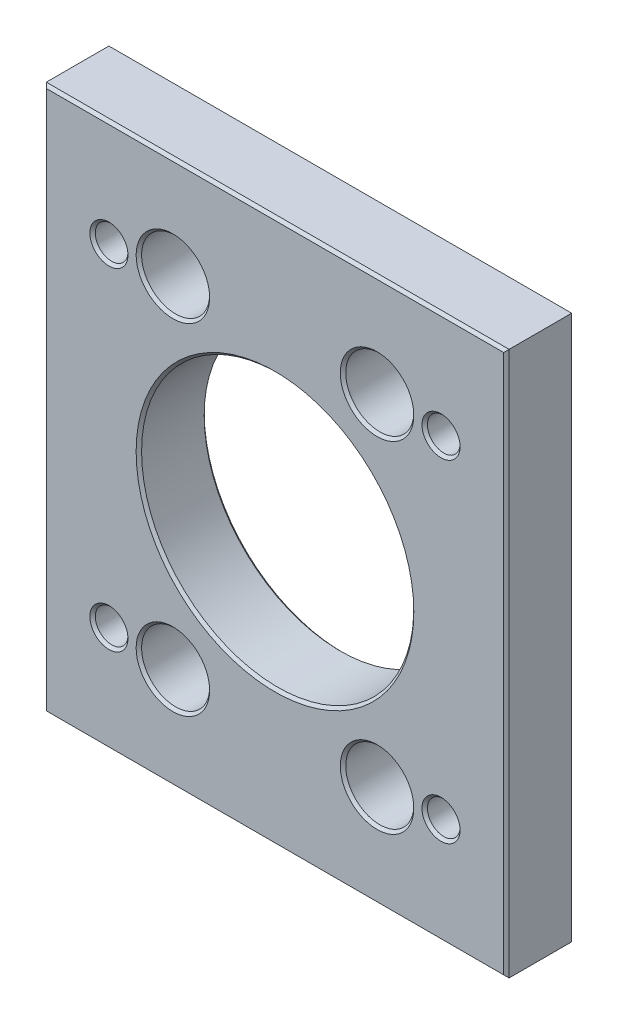
ISO-10303-21;
HEADER;
FILE_DESCRIPTION(('STEP AP214'),'2;1');
FILE_NAME('part.step','',(''),(''),'','','');
FILE_SCHEMA(('AUTOMOTIVE_DESIGN { 1 0 10303 214 1 1 1 1 }'));
ENDSEC;
DATA;
#1=APPLICATION_CONTEXT('core data for automotive mechanical design processes');
#2=APPLICATION_PROTOCOL_DEFINITION('international standard','automotive_design',2000,#1);
#3=PRODUCT_CONTEXT('',#1,'mechanical');
#4=PRODUCT('Part','Part','',(#3));
#5=PRODUCT_RELATED_PRODUCT_CATEGORY('part','',(#4));
#6=PRODUCT_DEFINITION_FORMATION('','',#4);
#7=PRODUCT_DEFINITION_CONTEXT('part definition',#1,'design');
#8=PRODUCT_DEFINITION('design','',#6,#7);
#9=PRODUCT_DEFINITION_SHAPE('','',#8);
#10=(LENGTH_UNIT() NAMED_UNIT(*) SI_UNIT(.MILLI.,.METRE.));
#11=(NAMED_UNIT(*) PLANE_ANGLE_UNIT() SI_UNIT($,.RADIAN.));
#12=(NAMED_UNIT(*) SI_UNIT($,.STERADIAN.) SOLID_ANGLE_UNIT());
#13=UNCERTAINTY_MEASURE_WITH_UNIT(LENGTH_MEASURE(1.E-05),#10,'distance_accuracy_value','');
#14=(GEOMETRIC_REPRESENTATION_CONTEXT(3) GLOBAL_UNCERTAINTY_ASSIGNED_CONTEXT((#13)) GLOBAL_UNIT_ASSIGNED_CONTEXT((#10,
#11,#12)) REPRESENTATION_CONTEXT('',''));
#15=CARTESIAN_POINT('',(0.,0.,0.));
#16=DIRECTION('',(0.,0.,1.));
#17=DIRECTION('',(1.,0.,0.));
#18=AXIS2_PLACEMENT_3D('',#15,#16,#17);
#19=CARTESIAN_POINT('',(0.,0.,6.35));
#20=DIRECTION('',(0.,0.,-1.));
#21=DIRECTION('',(-1.,0.,0.));
#22=AXIS2_PLACEMENT_3D('',#19,#20,#21);
#23=PLANE('',#22);
#24=CARTESIAN_POINT('',(0.,0.,6.35));
#25=DIRECTION('',(0.,0.,-1.));
#26=DIRECTION('',(-1.,0.,0.));
#27=AXIS2_PLACEMENT_3D('',#24,#25,#26);
#28=CIRCLE('',#27,12.954);
#29=CARTESIAN_POINT('',(-12.954,0.,6.35));
#30=VERTEX_POINT('',#29);
#31=EDGE_CURVE('E13',#30,#30,#28,.T.);
#32=ORIENTED_EDGE('',*,*,#31,.T.);
#33=EDGE_LOOP('',(#32));
#34=FACE_BOUND('',#33,.T.);
#35=CARTESIAN_POINT('',(15.494,15.494,6.35));
#36=DIRECTION('',(0.,0.,-1.));
#37=DIRECTION('',(-1.,0.,0.));
#38=AXIS2_PLACEMENT_3D('',#35,#36,#37);
#39=CIRCLE('',#38,1.77799999999999);
#40=CARTESIAN_POINT('',(13.716,15.494,6.35));
#41=VERTEX_POINT('',#40);
#42=EDGE_CURVE('E53',#41,#41,#39,.T.);
#43=ORIENTED_EDGE('',*,*,#42,.T.);
#44=EDGE_LOOP('',(#43));
#45=FACE_BOUND('',#44,.T.);
#46=CARTESIAN_POINT('',(9.525,15.875,6.35));
#47=DIRECTION('',(0.,0.,-1.));
#48=DIRECTION('',(-1.,0.,0.));
#49=AXIS2_PLACEMENT_3D('',#46,#47,#48);
#50=CIRCLE('',#49,3.42900000000001);
#51=CARTESIAN_POINT('',(6.09599999999999,15.875,6.35));
#52=VERTEX_POINT('',#51);
#53=EDGE_CURVE('E252',#52,#52,#50,.T.);
#54=ORIENTED_EDGE('',*,*,#53,.T.);
#55=EDGE_LOOP('',(#54));
#56=FACE_BOUND('',#55,.T.);
#57=CARTESIAN_POINT('',(15.494,-15.494,6.35));
#58=DIRECTION('',(0.,0.,-1.));
#59=DIRECTION('',(-1.,0.,0.));
#60=AXIS2_PLACEMENT_3D('',#57,#58,#59);
#61=CIRCLE('',#60,1.77799999999999);
#62=CARTESIAN_POINT('',(13.716,-15.494,6.35));
#63=VERTEX_POINT('',#62);
#64=EDGE_CURVE('E249',#63,#63,#61,.T.);
#65=ORIENTED_EDGE('',*,*,#64,.T.);
#66=EDGE_LOOP('',(#65));
#67=FACE_BOUND('',#66,.T.);
#68=CARTESIAN_POINT('',(9.525,-15.875,6.35));
#69=DIRECTION('',(0.,0.,-1.));
#70=DIRECTION('',(-1.,0.,0.));
#71=AXIS2_PLACEMENT_3D('',#68,#69,#70);
#72=CIRCLE('',#71,3.42900000000001);
#73=CARTESIAN_POINT('',(6.09599999999999,-15.875,6.35));
#74=VERTEX_POINT('',#73);
#75=EDGE_CURVE('E246',#74,#74,#72,.T.);
#76=ORIENTED_EDGE('',*,*,#75,.T.);
#77=EDGE_LOOP('',(#76));
#78=FACE_BOUND('',#77,.T.);
#79=CARTESIAN_POINT('',(-9.525,-15.875,6.35));
#80=DIRECTION('',(0.,0.,-1.));
#81=DIRECTION('',(-1.,0.,0.));
#82=AXIS2_PLACEMENT_3D('',#79,#80,#81);
#83=CIRCLE('',#82,3.42900000000001);
#84=CARTESIAN_POINT('',(-12.954,-15.875,6.35));
#85=VERTEX_POINT('',#84);
#86=EDGE_CURVE('E243',#85,#85,#83,.T.);
#87=ORIENTED_EDGE('',*,*,#86,.T.);
#88=EDGE_LOOP('',(#87));
#89=FACE_BOUND('',#88,.T.);
#90=CARTESIAN_POINT('',(-15.494,-15.494,6.35));
#91=DIRECTION('',(0.,0.,-1.));
#92=DIRECTION('',(-1.,0.,0.));
#93=AXIS2_PLACEMENT_3D('',#90,#91,#92);
#94=CIRCLE('',#93,1.77799999999999);
#95=CARTESIAN_POINT('',(-17.272,-15.494,6.35));
#96=VERTEX_POINT('',#95);
#97=EDGE_CURVE('E240',#96,#96,#94,.T.);
#98=ORIENTED_EDGE('',*,*,#97,.T.);
#99=EDGE_LOOP('',(#98));
#100=FACE_BOUND('',#99,.T.);
#101=CARTESIAN_POINT('',(-9.525,15.875,6.35));
#102=DIRECTION('',(0.,0.,-1.));
#103=DIRECTION('',(-1.,0.,0.));
#104=AXIS2_PLACEMENT_3D('',#101,#102,#103);
#105=CIRCLE('',#104,3.42900000000001);
#106=CARTESIAN_POINT('',(-12.954,15.875,6.35));
#107=VERTEX_POINT('',#106);
#108=EDGE_CURVE('E237',#107,#107,#105,.T.);
#109=ORIENTED_EDGE('',*,*,#108,.T.);
#110=EDGE_LOOP('',(#109));
#111=FACE_BOUND('',#110,.T.);
#112=CARTESIAN_POINT('',(-15.494,15.494,6.35));
#113=DIRECTION('',(0.,0.,-1.));
#114=DIRECTION('',(-1.,0.,0.));
#115=AXIS2_PLACEMENT_3D('',#112,#113,#114);
#116=CIRCLE('',#115,1.77800000000001);
#117=CARTESIAN_POINT('',(-17.272,15.494,6.35));
#118=VERTEX_POINT('',#117);
#119=EDGE_CURVE('E234',#118,#118,#116,.T.);
#120=ORIENTED_EDGE('',*,*,#119,.T.);
#121=EDGE_LOOP('',(#120));
#122=FACE_BOUND('',#121,.T.);
#123=DIRECTION('',(0.,-1.,0.));
#124=VECTOR('',#123,1.);
#125=CARTESIAN_POINT('',(-21.336,0.,6.35));
#126=LINE('',#125,#124);
#127=CARTESIAN_POINT('',(-21.336,25.146,6.35));
#128=VERTEX_POINT('',#127);
#129=CARTESIAN_POINT('',(-21.336,-25.146,6.35));
#130=VERTEX_POINT('',#129);
#131=EDGE_CURVE('E61',#128,#130,#126,.T.);
#132=ORIENTED_EDGE('',*,*,#131,.T.);
#133=DIRECTION('',(1.,0.,0.));
#134=VECTOR('',#133,1.);
#135=CARTESIAN_POINT('',(0.,-25.146,6.35));
#136=LINE('',#135,#134);
#137=CARTESIAN_POINT('',(21.336,-25.146,6.35));
#138=VERTEX_POINT('',#137);
#139=EDGE_CURVE('E232',#130,#138,#136,.T.);
#140=ORIENTED_EDGE('',*,*,#139,.T.);
#141=DIRECTION('',(0.,1.,0.));
#142=VECTOR('',#141,1.);
#143=CARTESIAN_POINT('',(21.336,0.,6.35));
#144=LINE('',#143,#142);
#145=CARTESIAN_POINT('',(21.336,25.146,6.35));
#146=VERTEX_POINT('',#145);
#147=EDGE_CURVE('E228',#138,#146,#144,.T.);
#148=ORIENTED_EDGE('',*,*,#147,.T.);
#149=DIRECTION('',(-1.,0.,0.));
#150=VECTOR('',#149,1.);
#151=CARTESIAN_POINT('',(0.,25.146,6.35));
#152=LINE('',#151,#150);
#153=EDGE_CURVE('E66',#146,#128,#152,.T.);
#154=ORIENTED_EDGE('',*,*,#153,.T.);
#155=EDGE_LOOP('',(#132,#140,#148,#154));
#156=FACE_BOUND('',#155,.T.);
#157=ADVANCED_FACE('F44',(#34,#45,#56,#67,#78,#89,#100,#111,#122,#156),#23,.F.);
#158=CARTESIAN_POINT('',(0.,0.,0.));
#159=DIRECTION('',(0.,0.,-1.));
#160=DIRECTION('',(-1.,0.,0.));
#161=AXIS2_PLACEMENT_3D('',#158,#159,#160);
#162=PLANE('',#161);
#163=CARTESIAN_POINT('',(0.,0.,0.));
#164=DIRECTION('',(0.,0.,-1.));
#165=DIRECTION('',(-1.,0.,0.));
#166=AXIS2_PLACEMENT_3D('',#163,#164,#165);
#167=CIRCLE('',#166,12.954);
#168=CARTESIAN_POINT('',(-12.954,0.,0.));
#169=VERTEX_POINT('',#168);
#170=EDGE_CURVE('E155',#169,#169,#167,.F.);
#171=ORIENTED_EDGE('',*,*,#170,.T.);
#172=EDGE_LOOP('',(#171));
#173=FACE_BOUND('',#172,.T.);
#174=CARTESIAN_POINT('',(9.525,15.875,0.));
#175=DIRECTION('',(0.,0.,-1.));
#176=DIRECTION('',(-1.,0.,0.));
#177=AXIS2_PLACEMENT_3D('',#174,#175,#176);
#178=CIRCLE('',#177,3.42899999999999);
#179=CARTESIAN_POINT('',(6.09600000000001,15.875,0.));
#180=VERTEX_POINT('',#179);
#181=EDGE_CURVE('E152',#180,#180,#178,.F.);
#182=ORIENTED_EDGE('',*,*,#181,.T.);
#183=EDGE_LOOP('',(#182));
#184=FACE_BOUND('',#183,.T.);
#185=CARTESIAN_POINT('',(9.525,-15.875,0.));
#186=DIRECTION('',(0.,0.,-1.));
#187=DIRECTION('',(-1.,0.,0.));
#188=AXIS2_PLACEMENT_3D('',#185,#186,#187);
#189=CIRCLE('',#188,3.42899999999999);
#190=CARTESIAN_POINT('',(6.09600000000001,-15.875,0.));
#191=VERTEX_POINT('',#190);
#192=EDGE_CURVE('E149',#191,#191,#189,.F.);
#193=ORIENTED_EDGE('',*,*,#192,.T.);
#194=EDGE_LOOP('',(#193));
#195=FACE_BOUND('',#194,.T.);
#196=CARTESIAN_POINT('',(-15.494,-15.494,0.));
#197=DIRECTION('',(0.,0.,-1.));
#198=DIRECTION('',(-1.,0.,0.));
#199=AXIS2_PLACEMENT_3D('',#196,#197,#198);
#200=CIRCLE('',#199,1.77799999999999);
#201=CARTESIAN_POINT('',(-17.272,-15.494,0.));
#202=VERTEX_POINT('',#201);
#203=EDGE_CURVE('E142',#202,#202,#200,.F.);
#204=ORIENTED_EDGE('',*,*,#203,.T.);
#205=EDGE_LOOP('',(#204));
#206=FACE_BOUND('',#205,.T.);
#207=CARTESIAN_POINT('',(-15.494,15.494,0.));
#208=DIRECTION('',(0.,0.,-1.));
#209=DIRECTION('',(-1.,0.,0.));
#210=AXIS2_PLACEMENT_3D('',#207,#208,#209);
#211=CIRCLE('',#210,1.77799999999999);
#212=CARTESIAN_POINT('',(-17.272,15.494,0.));
#213=VERTEX_POINT('',#212);
#214=EDGE_CURVE('E139',#213,#213,#211,.F.);
#215=ORIENTED_EDGE('',*,*,#214,.T.);
#216=EDGE_LOOP('',(#215));
#217=FACE_BOUND('',#216,.T.);
#218=DIRECTION('',(0.,1.,0.));
#219=VECTOR('',#218,1.);
#220=CARTESIAN_POINT('',(-21.336,25.4,0.));
#221=LINE('',#220,#219);
#222=CARTESIAN_POINT('',(-21.336,-25.146,0.));
#223=VERTEX_POINT('',#222);
#224=CARTESIAN_POINT('',(-21.336,25.146,0.));
#225=VERTEX_POINT('',#224);
#226=EDGE_CURVE('E138',#223,#225,#221,.T.);
#227=ORIENTED_EDGE('',*,*,#226,.T.);
#228=DIRECTION('',(1.,0.,0.));
#229=VECTOR('',#228,1.);
#230=CARTESIAN_POINT('',(21.59,25.146,0.));
#231=LINE('',#230,#229);
#232=CARTESIAN_POINT('',(21.336,25.146,0.));
#233=VERTEX_POINT('',#232);
#234=EDGE_CURVE('E116',#225,#233,#231,.T.);
#235=ORIENTED_EDGE('',*,*,#234,.T.);
#236=DIRECTION('',(0.,-1.,0.));
#237=VECTOR('',#236,1.);
#238=CARTESIAN_POINT('',(21.336,-25.4,0.));
#239=LINE('',#238,#237);
#240=CARTESIAN_POINT('',(21.336,-25.146,0.));
#241=VERTEX_POINT('',#240);
#242=EDGE_CURVE('E126',#233,#241,#239,.T.);
#243=ORIENTED_EDGE('',*,*,#242,.T.);
#244=DIRECTION('',(-1.,0.,0.));
#245=VECTOR('',#244,1.);
#246=CARTESIAN_POINT('',(-21.59,-25.146,0.));
#247=LINE('',#246,#245);
#248=EDGE_CURVE('E132',#241,#223,#247,.T.);
#249=ORIENTED_EDGE('',*,*,#248,.T.);
#250=EDGE_LOOP('',(#227,#235,#243,#249));
#251=FACE_BOUND('',#250,.T.);
#252=CARTESIAN_POINT('',(-9.525,15.875,0.));
#253=DIRECTION('',(0.,0.,-1.));
#254=DIRECTION('',(-1.,0.,0.));
#255=AXIS2_PLACEMENT_3D('',#252,#253,#254);
#256=CIRCLE('',#255,3.42899999999999);
#257=CARTESIAN_POINT('',(-12.954,15.875,0.));
#258=VERTEX_POINT('',#257);
#259=EDGE_CURVE('E133',#258,#258,#256,.F.);
#260=ORIENTED_EDGE('',*,*,#259,.T.);
#261=EDGE_LOOP('',(#260));
#262=FACE_BOUND('',#261,.T.);
#263=CARTESIAN_POINT('',(-9.525,-15.875,0.));
#264=DIRECTION('',(0.,0.,-1.));
#265=DIRECTION('',(-1.,0.,0.));
#266=AXIS2_PLACEMENT_3D('',#263,#264,#265);
#267=CIRCLE('',#266,3.42899999999999);
#268=CARTESIAN_POINT('',(-12.954,-15.875,0.));
#269=VERTEX_POINT('',#268);
#270=EDGE_CURVE('E300',#269,#269,#267,.F.);
#271=ORIENTED_EDGE('',*,*,#270,.T.);
#272=EDGE_LOOP('',(#271));
#273=FACE_BOUND('',#272,.T.);
#274=CARTESIAN_POINT('',(15.494,-15.494,0.));
#275=DIRECTION('',(0.,0.,-1.));
#276=DIRECTION('',(-1.,0.,0.));
#277=AXIS2_PLACEMENT_3D('',#274,#275,#276);
#278=CIRCLE('',#277,1.77799999999999);
#279=CARTESIAN_POINT('',(13.716,-15.494,0.));
#280=VERTEX_POINT('',#279);
#281=EDGE_CURVE('E292',#280,#280,#278,.F.);
#282=ORIENTED_EDGE('',*,*,#281,.T.);
#283=EDGE_LOOP('',(#282));
#284=FACE_BOUND('',#283,.T.);
#285=CARTESIAN_POINT('',(15.494,15.494,0.));
#286=DIRECTION('',(0.,0.,-1.));
#287=DIRECTION('',(-1.,0.,0.));
#288=AXIS2_PLACEMENT_3D('',#285,#286,#287);
#289=CIRCLE('',#288,1.77799999999999);
#290=CARTESIAN_POINT('',(13.716,15.494,0.));
#291=VERTEX_POINT('',#290);
#292=EDGE_CURVE('E289',#291,#291,#289,.F.);
#293=ORIENTED_EDGE('',*,*,#292,.T.);
#294=EDGE_LOOP('',(#293));
#295=FACE_BOUND('',#294,.T.);
#296=ADVANCED_FACE('F135',(#173,#184,#195,#206,#217,#251,#262,#273,#284,#295),#162,.T.);
#297=CARTESIAN_POINT('',(21.59,-25.4,6.35));
#298=DIRECTION('',(-1.,0.,0.));
#299=DIRECTION('',(0.,0.,1.));
#300=AXIS2_PLACEMENT_3D('',#297,#298,#299);
#301=PLANE('',#300);
#302=DIRECTION('',(0.,0.,-1.));
#303=VECTOR('',#302,1.);
#304=CARTESIAN_POINT('',(21.59,-25.4,6.35));
#305=LINE('',#304,#303);
#306=CARTESIAN_POINT('',(21.59,-25.4,6.096));
#307=VERTEX_POINT('',#306);
#308=CARTESIAN_POINT('',(21.59,-25.4,0.254000000000004));
#309=VERTEX_POINT('',#308);
#310=EDGE_CURVE('E261',#307,#309,#305,.T.);
#311=ORIENTED_EDGE('',*,*,#310,.T.);
#312=DIRECTION('',(0.,1.,0.));
#313=VECTOR('',#312,1.);
#314=CARTESIAN_POINT('',(21.59,25.4,0.254000000000004));
#315=LINE('',#314,#313);
#316=CARTESIAN_POINT('',(21.59,25.4,0.254000000000004));
#317=VERTEX_POINT('',#316);
#318=EDGE_CURVE('E202',#309,#317,#315,.T.);
#319=ORIENTED_EDGE('',*,*,#318,.T.);
#320=DIRECTION('',(0.,0.,-1.));
#321=VECTOR('',#320,1.);
#322=CARTESIAN_POINT('',(21.59,25.4,6.35));
#323=LINE('',#322,#321);
#324=CARTESIAN_POINT('',(21.59,25.4,6.096));
#325=VERTEX_POINT('',#324);
#326=EDGE_CURVE('E282',#325,#317,#323,.T.);
#327=ORIENTED_EDGE('',*,*,#326,.F.);
#328=DIRECTION('',(0.,-1.,0.));
#329=VECTOR('',#328,1.);
#330=CARTESIAN_POINT('',(21.59,-25.4,6.096));
#331=LINE('',#330,#329);
#332=EDGE_CURVE('E200',#325,#307,#331,.T.);
#333=ORIENTED_EDGE('',*,*,#332,.T.);
#334=EDGE_LOOP('',(#311,#319,#327,#333));
#335=FACE_BOUND('',#334,.T.);
#336=ADVANCED_FACE('F287',(#335),#301,.F.);
#337=CARTESIAN_POINT('',(-21.59,25.4,6.35));
#338=DIRECTION('',(0.,-1.,0.));
#339=DIRECTION('',(0.,0.,-1.));
#340=AXIS2_PLACEMENT_3D('',#337,#338,#339);
#341=PLANE('',#340);
#342=ORIENTED_EDGE('',*,*,#326,.T.);
#343=DIRECTION('',(-1.,0.,0.));
#344=VECTOR('',#343,1.);
#345=CARTESIAN_POINT('',(-21.59,25.4,0.254000000000004));
#346=LINE('',#345,#344);
#347=CARTESIAN_POINT('',(-21.59,25.4,0.254000000000004));
#348=VERTEX_POINT('',#347);
#349=EDGE_CURVE('E119',#317,#348,#346,.T.);
#350=ORIENTED_EDGE('',*,*,#349,.T.);
#351=DIRECTION('',(0.,0.,-1.));
#352=VECTOR('',#351,1.);
#353=CARTESIAN_POINT('',(-21.59,25.4,6.35));
#354=LINE('',#353,#352);
#355=CARTESIAN_POINT('',(-21.59,25.4,6.096));
#356=VERTEX_POINT('',#355);
#357=EDGE_CURVE('E284',#356,#348,#354,.T.);
#358=ORIENTED_EDGE('',*,*,#357,.F.);
#359=DIRECTION('',(1.,0.,0.));
#360=VECTOR('',#359,1.);
#361=CARTESIAN_POINT('',(-21.59,25.4,6.096));
#362=LINE('',#361,#360);
#363=EDGE_CURVE('E188',#356,#325,#362,.T.);
#364=ORIENTED_EDGE('',*,*,#363,.T.);
#365=EDGE_LOOP('',(#342,#350,#358,#364));
#366=FACE_BOUND('',#365,.T.);
#367=ADVANCED_FACE('F281',(#366),#341,.F.);
#368=CARTESIAN_POINT('',(-21.59,-25.4,6.35));
#369=DIRECTION('',(1.,0.,0.));
#370=DIRECTION('',(0.,0.,-1.));
#371=AXIS2_PLACEMENT_3D('',#368,#369,#370);
#372=PLANE('',#371);
#373=ORIENTED_EDGE('',*,*,#357,.T.);
#374=DIRECTION('',(0.,-1.,0.));
#375=VECTOR('',#374,1.);
#376=CARTESIAN_POINT('',(-21.59,-25.4,0.254000000000004));
#377=LINE('',#376,#375);
#378=CARTESIAN_POINT('',(-21.59,-25.4,0.254000000000004));
#379=VERTEX_POINT('',#378);
#380=EDGE_CURVE('E193',#348,#379,#377,.T.);
#381=ORIENTED_EDGE('',*,*,#380,.T.);
#382=DIRECTION('',(0.,0.,-1.));
#383=VECTOR('',#382,1.);
#384=CARTESIAN_POINT('',(-21.59,-25.4,6.35));
#385=LINE('',#384,#383);
#386=CARTESIAN_POINT('',(-21.59,-25.4,6.096));
#387=VERTEX_POINT('',#386);
#388=EDGE_CURVE('E294',#387,#379,#385,.T.);
#389=ORIENTED_EDGE('',*,*,#388,.F.);
#390=DIRECTION('',(0.,1.,0.));
#391=VECTOR('',#390,1.);
#392=CARTESIAN_POINT('',(-21.59,-25.4,6.096));
#393=LINE('',#392,#391);
#394=EDGE_CURVE('E191',#387,#356,#393,.T.);
#395=ORIENTED_EDGE('',*,*,#394,.T.);
#396=EDGE_LOOP('',(#373,#381,#389,#395));
#397=FACE_BOUND('',#396,.T.);
#398=ADVANCED_FACE('F314',(#397),#372,.F.);
#399=CARTESIAN_POINT('',(-21.59,-25.4,6.35));
#400=DIRECTION('',(0.,1.,0.));
#401=DIRECTION('',(0.,0.,1.));
#402=AXIS2_PLACEMENT_3D('',#399,#400,#401);
#403=PLANE('',#402);
#404=ORIENTED_EDGE('',*,*,#388,.T.);
#405=DIRECTION('',(1.,0.,0.));
#406=VECTOR('',#405,1.);
#407=CARTESIAN_POINT('',(21.59,-25.4,0.254000000000004));
#408=LINE('',#407,#406);
#409=EDGE_CURVE('E198',#379,#309,#408,.T.);
#410=ORIENTED_EDGE('',*,*,#409,.T.);
#411=ORIENTED_EDGE('',*,*,#310,.F.);
#412=DIRECTION('',(-1.,0.,0.));
#413=VECTOR('',#412,1.);
#414=CARTESIAN_POINT('',(-21.59,-25.4,6.096));
#415=LINE('',#414,#413);
#416=EDGE_CURVE('E195',#307,#387,#415,.T.);
#417=ORIENTED_EDGE('',*,*,#416,.T.);
#418=EDGE_LOOP('',(#404,#410,#411,#417));
#419=FACE_BOUND('',#418,.T.);
#420=ADVANCED_FACE('F318',(#419),#403,.F.);
#421=CARTESIAN_POINT('',(-15.494,15.494,6.35));
#422=DIRECTION('',(0.,0.,-1.));
#423=DIRECTION('',(-1.,0.,0.));
#424=AXIS2_PLACEMENT_3D('',#421,#422,#423);
#425=CYLINDRICAL_SURFACE('',#424,1.524);
#426=CARTESIAN_POINT('',(-15.494,15.494,0.253999999999992));
#427=DIRECTION('',(0.,0.,-1.));
#428=DIRECTION('',(-1.,0.,0.));
#429=AXIS2_PLACEMENT_3D('',#426,#427,#428);
#430=CIRCLE('',#429,1.524);
#431=CARTESIAN_POINT('',(-17.018,15.494,0.253999999999992));
#432=VERTEX_POINT('',#431);
#433=EDGE_CURVE('E185',#432,#432,#430,.T.);
#434=ORIENTED_EDGE('',*,*,#433,.T.);
#435=EDGE_LOOP('',(#434));
#436=FACE_BOUND('',#435,.T.);
#437=CARTESIAN_POINT('',(-15.494,15.494,6.09599999999999));
#438=DIRECTION('',(0.,0.,-1.));
#439=DIRECTION('',(-1.,0.,0.));
#440=AXIS2_PLACEMENT_3D('',#437,#438,#439);
#441=CIRCLE('',#440,1.524);
#442=CARTESIAN_POINT('',(-17.018,15.494,6.09599999999999));
#443=VERTEX_POINT('',#442);
#444=EDGE_CURVE('E182',#443,#443,#441,.F.);
#445=ORIENTED_EDGE('',*,*,#444,.T.);
#446=EDGE_LOOP('',(#445));
#447=FACE_BOUND('',#446,.T.);
#448=ADVANCED_FACE('F334',(#436,#447),#425,.F.);
#449=CARTESIAN_POINT('',(-9.525,15.875,6.35));
#450=DIRECTION('',(0.,0.,-1.));
#451=DIRECTION('',(-1.,0.,0.));
#452=AXIS2_PLACEMENT_3D('',#449,#450,#451);
#453=CYLINDRICAL_SURFACE('',#452,3.175);
#454=CARTESIAN_POINT('',(-9.525,15.875,0.253999999999996));
#455=DIRECTION('',(0.,0.,-1.));
#456=DIRECTION('',(-1.,0.,0.));
#457=AXIS2_PLACEMENT_3D('',#454,#455,#456);
#458=CIRCLE('',#457,3.175);
#459=CARTESIAN_POINT('',(-12.7,15.875,0.253999999999996));
#460=VERTEX_POINT('',#459);
#461=EDGE_CURVE('E207',#460,#460,#458,.T.);
#462=ORIENTED_EDGE('',*,*,#461,.T.);
#463=EDGE_LOOP('',(#462));
#464=FACE_BOUND('',#463,.T.);
#465=CARTESIAN_POINT('',(-9.525,15.875,6.096));
#466=DIRECTION('',(0.,0.,-1.));
#467=DIRECTION('',(-1.,0.,0.));
#468=AXIS2_PLACEMENT_3D('',#465,#466,#467);
#469=CIRCLE('',#468,3.175);
#470=CARTESIAN_POINT('',(-12.7,15.875,6.096));
#471=VERTEX_POINT('',#470);
#472=EDGE_CURVE('E204',#471,#471,#469,.F.);
#473=ORIENTED_EDGE('',*,*,#472,.T.);
#474=EDGE_LOOP('',(#473));
#475=FACE_BOUND('',#474,.T.);
#476=ADVANCED_FACE('F577',(#464,#475),#453,.F.);
#477=CARTESIAN_POINT('',(-15.494,-15.494,6.35));
#478=DIRECTION('',(0.,0.,-1.));
#479=DIRECTION('',(-1.,0.,0.));
#480=AXIS2_PLACEMENT_3D('',#477,#478,#479);
#481=CYLINDRICAL_SURFACE('',#480,1.524);
#482=CARTESIAN_POINT('',(-15.494,-15.494,0.253999999999996));
#483=DIRECTION('',(0.,0.,-1.));
#484=DIRECTION('',(-1.,0.,0.));
#485=AXIS2_PLACEMENT_3D('',#482,#483,#484);
#486=CIRCLE('',#485,1.524);
#487=CARTESIAN_POINT('',(-17.018,-15.494,0.253999999999996));
#488=VERTEX_POINT('',#487);
#489=EDGE_CURVE('E179',#488,#488,#486,.T.);
#490=ORIENTED_EDGE('',*,*,#489,.T.);
#491=EDGE_LOOP('',(#490));
#492=FACE_BOUND('',#491,.T.);
#493=CARTESIAN_POINT('',(-15.494,-15.494,6.096));
#494=DIRECTION('',(0.,0.,-1.));
#495=DIRECTION('',(-1.,0.,0.));
#496=AXIS2_PLACEMENT_3D('',#493,#494,#495);
#497=CIRCLE('',#496,1.524);
#498=CARTESIAN_POINT('',(-17.018,-15.494,6.096));
#499=VERTEX_POINT('',#498);
#500=EDGE_CURVE('E176',#499,#499,#497,.F.);
#501=ORIENTED_EDGE('',*,*,#500,.T.);
#502=EDGE_LOOP('',(#501));
#503=FACE_BOUND('',#502,.T.);
#504=ADVANCED_FACE('F569',(#492,#503),#481,.F.);
#505=CARTESIAN_POINT('',(-9.525,-15.875,6.35));
#506=DIRECTION('',(0.,0.,-1.));
#507=DIRECTION('',(-1.,0.,0.));
#508=AXIS2_PLACEMENT_3D('',#505,#506,#507);
#509=CYLINDRICAL_SURFACE('',#508,3.175);
#510=CARTESIAN_POINT('',(-9.525,-15.875,0.253999999999996));
#511=DIRECTION('',(0.,0.,-1.));
#512=DIRECTION('',(-1.,0.,0.));
#513=AXIS2_PLACEMENT_3D('',#510,#511,#512);
#514=CIRCLE('',#513,3.175);
#515=CARTESIAN_POINT('',(-12.7,-15.875,0.253999999999996));
#516=VERTEX_POINT('',#515);
#517=EDGE_CURVE('E213',#516,#516,#514,.T.);
#518=ORIENTED_EDGE('',*,*,#517,.T.);
#519=EDGE_LOOP('',(#518));
#520=FACE_BOUND('',#519,.T.);
#521=CARTESIAN_POINT('',(-9.525,-15.875,6.096));
#522=DIRECTION('',(0.,0.,-1.));
#523=DIRECTION('',(-1.,0.,0.));
#524=AXIS2_PLACEMENT_3D('',#521,#522,#523);
#525=CIRCLE('',#524,3.175);
#526=CARTESIAN_POINT('',(-12.7,-15.875,6.096));
#527=VERTEX_POINT('',#526);
#528=EDGE_CURVE('E210',#527,#527,#525,.F.);
#529=ORIENTED_EDGE('',*,*,#528,.T.);
#530=EDGE_LOOP('',(#529));
#531=FACE_BOUND('',#530,.T.);
#532=ADVANCED_FACE('F561',(#520,#531),#509,.F.);
#533=CARTESIAN_POINT('',(9.525,-15.875,6.35));
#534=DIRECTION('',(0.,0.,-1.));
#535=DIRECTION('',(-1.,0.,0.));
#536=AXIS2_PLACEMENT_3D('',#533,#534,#535);
#537=CYLINDRICAL_SURFACE('',#536,3.175);
#538=CARTESIAN_POINT('',(9.525,-15.875,0.253999999999983));
#539=DIRECTION('',(0.,0.,-1.));
#540=DIRECTION('',(-1.,0.,0.));
#541=AXIS2_PLACEMENT_3D('',#538,#539,#540);
#542=CIRCLE('',#541,3.175);
#543=CARTESIAN_POINT('',(6.35,-15.875,0.253999999999983));
#544=VERTEX_POINT('',#543);
#545=EDGE_CURVE('E173',#544,#544,#542,.T.);
#546=ORIENTED_EDGE('',*,*,#545,.T.);
#547=EDGE_LOOP('',(#546));
#548=FACE_BOUND('',#547,.T.);
#549=CARTESIAN_POINT('',(9.525,-15.875,6.096));
#550=DIRECTION('',(0.,0.,-1.));
#551=DIRECTION('',(-1.,0.,0.));
#552=AXIS2_PLACEMENT_3D('',#549,#550,#551);
#553=CIRCLE('',#552,3.175);
#554=CARTESIAN_POINT('',(6.35,-15.875,6.096));
#555=VERTEX_POINT('',#554);
#556=EDGE_CURVE('E170',#555,#555,#553,.F.);
#557=ORIENTED_EDGE('',*,*,#556,.T.);
#558=EDGE_LOOP('',(#557));
#559=FACE_BOUND('',#558,.T.);
#560=ADVANCED_FACE('F553',(#548,#559),#537,.F.);
#561=CARTESIAN_POINT('',(15.494,-15.494,6.35));
#562=DIRECTION('',(0.,0.,-1.));
#563=DIRECTION('',(-1.,0.,0.));
#564=AXIS2_PLACEMENT_3D('',#561,#562,#563);
#565=CYLINDRICAL_SURFACE('',#564,1.524);
#566=CARTESIAN_POINT('',(15.494,-15.494,0.253999999999991));
#567=DIRECTION('',(0.,0.,-1.));
#568=DIRECTION('',(-1.,0.,0.));
#569=AXIS2_PLACEMENT_3D('',#566,#567,#568);
#570=CIRCLE('',#569,1.524);
#571=CARTESIAN_POINT('',(13.97,-15.494,0.253999999999991));
#572=VERTEX_POINT('',#571);
#573=EDGE_CURVE('E219',#572,#572,#570,.T.);
#574=ORIENTED_EDGE('',*,*,#573,.T.);
#575=EDGE_LOOP('',(#574));
#576=FACE_BOUND('',#575,.T.);
#577=CARTESIAN_POINT('',(15.494,-15.494,6.09600000000001));
#578=DIRECTION('',(0.,0.,-1.));
#579=DIRECTION('',(-1.,0.,0.));
#580=AXIS2_PLACEMENT_3D('',#577,#578,#579);
#581=CIRCLE('',#580,1.524);
#582=CARTESIAN_POINT('',(13.97,-15.494,6.09600000000001));
#583=VERTEX_POINT('',#582);
#584=EDGE_CURVE('E216',#583,#583,#581,.F.);
#585=ORIENTED_EDGE('',*,*,#584,.T.);
#586=EDGE_LOOP('',(#585));
#587=FACE_BOUND('',#586,.T.);
#588=ADVANCED_FACE('F545',(#576,#587),#565,.F.);
#589=CARTESIAN_POINT('',(9.525,15.875,6.35));
#590=DIRECTION('',(0.,0.,-1.));
#591=DIRECTION('',(-1.,0.,0.));
#592=AXIS2_PLACEMENT_3D('',#589,#590,#591);
#593=CYLINDRICAL_SURFACE('',#592,3.175);
#594=CARTESIAN_POINT('',(9.525,15.875,0.253999999999983));
#595=DIRECTION('',(0.,0.,-1.));
#596=DIRECTION('',(-1.,0.,0.));
#597=AXIS2_PLACEMENT_3D('',#594,#595,#596);
#598=CIRCLE('',#597,3.175);
#599=CARTESIAN_POINT('',(6.35,15.875,0.253999999999983));
#600=VERTEX_POINT('',#599);
#601=EDGE_CURVE('E167',#600,#600,#598,.T.);
#602=ORIENTED_EDGE('',*,*,#601,.T.);
#603=EDGE_LOOP('',(#602));
#604=FACE_BOUND('',#603,.T.);
#605=CARTESIAN_POINT('',(9.525,15.875,6.096));
#606=DIRECTION('',(0.,0.,-1.));
#607=DIRECTION('',(-1.,0.,0.));
#608=AXIS2_PLACEMENT_3D('',#605,#606,#607);
#609=CIRCLE('',#608,3.175);
#610=CARTESIAN_POINT('',(6.35,15.875,6.096));
#611=VERTEX_POINT('',#610);
#612=EDGE_CURVE('E164',#611,#611,#609,.F.);
#613=ORIENTED_EDGE('',*,*,#612,.T.);
#614=EDGE_LOOP('',(#613));
#615=FACE_BOUND('',#614,.T.);
#616=ADVANCED_FACE('F537',(#604,#615),#593,.F.);
#617=CARTESIAN_POINT('',(15.494,15.494,6.35));
#618=DIRECTION('',(0.,0.,-1.));
#619=DIRECTION('',(-1.,0.,0.));
#620=AXIS2_PLACEMENT_3D('',#617,#618,#619);
#621=CYLINDRICAL_SURFACE('',#620,1.524);
#622=CARTESIAN_POINT('',(15.494,15.494,0.25399999999999));
#623=DIRECTION('',(0.,0.,-1.));
#624=DIRECTION('',(-1.,0.,0.));
#625=AXIS2_PLACEMENT_3D('',#622,#623,#624);
#626=CIRCLE('',#625,1.524);
#627=CARTESIAN_POINT('',(13.97,15.494,0.25399999999999));
#628=VERTEX_POINT('',#627);
#629=EDGE_CURVE('E225',#628,#628,#626,.T.);
#630=ORIENTED_EDGE('',*,*,#629,.T.);
#631=EDGE_LOOP('',(#630));
#632=FACE_BOUND('',#631,.T.);
#633=CARTESIAN_POINT('',(15.494,15.494,6.09600000000001));
#634=DIRECTION('',(0.,0.,-1.));
#635=DIRECTION('',(-1.,0.,0.));
#636=AXIS2_PLACEMENT_3D('',#633,#634,#635);
#637=CIRCLE('',#636,1.524);
#638=CARTESIAN_POINT('',(13.97,15.494,6.09600000000001));
#639=VERTEX_POINT('',#638);
#640=EDGE_CURVE('E222',#639,#639,#637,.F.);
#641=ORIENTED_EDGE('',*,*,#640,.T.);
#642=EDGE_LOOP('',(#641));
#643=FACE_BOUND('',#642,.T.);
#644=ADVANCED_FACE('F529',(#632,#643),#621,.F.);
#645=CARTESIAN_POINT('',(0.,0.,6.35));
#646=DIRECTION('',(0.,0.,-1.));
#647=DIRECTION('',(-1.,0.,0.));
#648=AXIS2_PLACEMENT_3D('',#645,#646,#647);
#649=CYLINDRICAL_SURFACE('',#648,12.7);
#650=CARTESIAN_POINT('',(0.,0.,0.253999999999999));
#651=DIRECTION('',(0.,0.,-1.));
#652=DIRECTION('',(-1.,0.,0.));
#653=AXIS2_PLACEMENT_3D('',#650,#651,#652);
#654=CIRCLE('',#653,12.7);
#655=CARTESIAN_POINT('',(-12.7,0.,0.253999999999999));
#656=VERTEX_POINT('',#655);
#657=EDGE_CURVE('E161',#656,#656,#654,.T.);
#658=ORIENTED_EDGE('',*,*,#657,.T.);
#659=EDGE_LOOP('',(#658));
#660=FACE_BOUND('',#659,.T.);
#661=CARTESIAN_POINT('',(0.,0.,6.09599999999999));
#662=DIRECTION('',(0.,0.,-1.));
#663=DIRECTION('',(-1.,0.,0.));
#664=AXIS2_PLACEMENT_3D('',#661,#662,#663);
#665=CIRCLE('',#664,12.7);
#666=CARTESIAN_POINT('',(-12.7,0.,6.09599999999999));
#667=VERTEX_POINT('',#666);
#668=EDGE_CURVE('E158',#667,#667,#665,.F.);
#669=ORIENTED_EDGE('',*,*,#668,.T.);
#670=EDGE_LOOP('',(#669));
#671=FACE_BOUND('',#670,.T.);
#672=ADVANCED_FACE('F349',(#660,#671),#649,.F.);
#673=CARTESIAN_POINT('',(0.,0.,0.));
#674=DIRECTION('',(0.,0.,-1.));
#675=DIRECTION('',(-1.,0.,0.));
#676=AXIS2_PLACEMENT_3D('',#673,#674,#675);
#677=CONICAL_SURFACE('',#676,12.954,0.785398163397442);
#678=ORIENTED_EDGE('',*,*,#657,.F.);
#679=EDGE_LOOP('',(#678));
#680=FACE_BOUND('',#679,.T.);
#681=ORIENTED_EDGE('',*,*,#170,.F.);
#682=EDGE_LOOP('',(#681));
#683=FACE_BOUND('',#682,.T.);
#684=ADVANCED_FACE('F345',(#680,#683),#677,.F.);
#685=CARTESIAN_POINT('',(9.525,15.875,0.));
#686=DIRECTION('',(0.,0.,-1.));
#687=DIRECTION('',(-1.,0.,0.));
#688=AXIS2_PLACEMENT_3D('',#685,#686,#687);
#689=CONICAL_SURFACE('',#688,3.42899999999999,0.785398163397456);
#690=ORIENTED_EDGE('',*,*,#601,.F.);
#691=EDGE_LOOP('',(#690));
#692=FACE_BOUND('',#691,.T.);
#693=ORIENTED_EDGE('',*,*,#181,.F.);
#694=EDGE_LOOP('',(#693));
#695=FACE_BOUND('',#694,.T.);
#696=ADVANCED_FACE('F348',(#692,#695),#689,.F.);
#697=CARTESIAN_POINT('',(9.525,-15.875,0.));
#698=DIRECTION('',(0.,0.,-1.));
#699=DIRECTION('',(-1.,0.,0.));
#700=AXIS2_PLACEMENT_3D('',#697,#698,#699);
#701=CONICAL_SURFACE('',#700,3.42899999999999,0.785398163397456);
#702=ORIENTED_EDGE('',*,*,#545,.F.);
#703=EDGE_LOOP('',(#702));
#704=FACE_BOUND('',#703,.T.);
#705=ORIENTED_EDGE('',*,*,#192,.F.);
#706=EDGE_LOOP('',(#705));
#707=FACE_BOUND('',#706,.T.);
#708=ADVANCED_FACE('F353',(#704,#707),#701,.F.);
#709=CARTESIAN_POINT('',(-15.494,-15.494,0.));
#710=DIRECTION('',(0.,0.,-1.));
#711=DIRECTION('',(-1.,0.,0.));
#712=AXIS2_PLACEMENT_3D('',#709,#710,#711);
#713=CONICAL_SURFACE('',#712,1.77799999999999,0.785398163397438);
#714=ORIENTED_EDGE('',*,*,#489,.F.);
#715=EDGE_LOOP('',(#714));
#716=FACE_BOUND('',#715,.T.);
#717=ORIENTED_EDGE('',*,*,#203,.F.);
#718=EDGE_LOOP('',(#717));
#719=FACE_BOUND('',#718,.T.);
#720=ADVANCED_FACE('F357',(#716,#719),#713,.F.);
#721=CARTESIAN_POINT('',(-15.494,15.494,0.));
#722=DIRECTION('',(0.,0.,-1.));
#723=DIRECTION('',(-1.,0.,0.));
#724=AXIS2_PLACEMENT_3D('',#721,#722,#723);
#725=CONICAL_SURFACE('',#724,1.77799999999999,0.785398163397439);
#726=ORIENTED_EDGE('',*,*,#433,.F.);
#727=EDGE_LOOP('',(#726));
#728=FACE_BOUND('',#727,.T.);
#729=ORIENTED_EDGE('',*,*,#214,.F.);
#730=EDGE_LOOP('',(#729));
#731=FACE_BOUND('',#730,.T.);
#732=ADVANCED_FACE('F361',(#728,#731),#725,.F.);
#733=CARTESIAN_POINT('',(-21.59,-25.4,0.254000000000004));
#734=DIRECTION('',(0.,-0.707106781186547,-0.707106781186547));
#735=DIRECTION('',(-1.,0.,0.));
#736=AXIS2_PLACEMENT_3D('',#733,#734,#735);
#737=PLANE('',#736);
#738=DIRECTION('',(0.577350269189626,0.577350269189626,-0.577350269189626));
#739=VECTOR('',#738,1.);
#740=CARTESIAN_POINT('',(-21.59,-25.4,0.254000000000004));
#741=LINE('',#740,#739);
#742=EDGE_CURVE('E122',#223,#379,#741,.F.);
#743=ORIENTED_EDGE('',*,*,#742,.F.);
#744=ORIENTED_EDGE('',*,*,#248,.F.);
#745=DIRECTION('',(-0.577350269189626,0.577350269189626,-0.577350269189626));
#746=VECTOR('',#745,1.);
#747=CARTESIAN_POINT('',(21.59,-25.4,0.254000000000004));
#748=LINE('',#747,#746);
#749=EDGE_CURVE('E129',#309,#241,#748,.T.);
#750=ORIENTED_EDGE('',*,*,#749,.F.);
#751=ORIENTED_EDGE('',*,*,#409,.F.);
#752=EDGE_LOOP('',(#743,#744,#750,#751));
#753=FACE_BOUND('',#752,.T.);
#754=ADVANCED_FACE('F307',(#753),#737,.T.);
#755=CARTESIAN_POINT('',(21.59,-25.4,0.254000000000004));
#756=DIRECTION('',(0.707106781186547,0.,-0.707106781186547));
#757=DIRECTION('',(0.,-1.,0.));
#758=AXIS2_PLACEMENT_3D('',#755,#756,#757);
#759=PLANE('',#758);
#760=ORIENTED_EDGE('',*,*,#749,.T.);
#761=ORIENTED_EDGE('',*,*,#242,.F.);
#762=DIRECTION('',(0.577350269189626,0.577350269189626,0.577350269189626));
#763=VECTOR('',#762,1.);
#764=CARTESIAN_POINT('',(4.65666666666666,8.46666666666666,-16.6793333333333));
#765=LINE('',#764,#763);
#766=EDGE_CURVE('E112',#317,#233,#765,.F.);
#767=ORIENTED_EDGE('',*,*,#766,.F.);
#768=ORIENTED_EDGE('',*,*,#318,.F.);
#769=EDGE_LOOP('',(#760,#761,#767,#768));
#770=FACE_BOUND('',#769,.T.);
#771=ADVANCED_FACE('F127',(#770),#759,.T.);
#772=CARTESIAN_POINT('',(-21.59,-25.4,0.254000000000004));
#773=DIRECTION('',(-0.707106781186547,0.,-0.707106781186547));
#774=DIRECTION('',(0.,1.,0.));
#775=AXIS2_PLACEMENT_3D('',#772,#773,#774);
#776=PLANE('',#775);
#777=ORIENTED_EDGE('',*,*,#742,.T.);
#778=ORIENTED_EDGE('',*,*,#380,.F.);
#779=DIRECTION('',(0.577350269189626,-0.577350269189626,-0.577350269189626));
#780=VECTOR('',#779,1.);
#781=CARTESIAN_POINT('',(-4.65666666666668,8.46666666666666,-16.6793333333333));
#782=LINE('',#781,#780);
#783=EDGE_CURVE('E123',#225,#348,#782,.F.);
#784=ORIENTED_EDGE('',*,*,#783,.F.);
#785=ORIENTED_EDGE('',*,*,#226,.F.);
#786=EDGE_LOOP('',(#777,#778,#784,#785));
#787=FACE_BOUND('',#786,.T.);
#788=ADVANCED_FACE('F310',(#787),#776,.T.);
#789=CARTESIAN_POINT('',(-21.59,25.4,0.254000000000004));
#790=DIRECTION('',(0.,0.707106781186547,-0.707106781186547));
#791=DIRECTION('',(1.,0.,0.));
#792=AXIS2_PLACEMENT_3D('',#789,#790,#791);
#793=PLANE('',#792);
#794=ORIENTED_EDGE('',*,*,#766,.T.);
#795=ORIENTED_EDGE('',*,*,#234,.F.);
#796=ORIENTED_EDGE('',*,*,#783,.T.);
#797=ORIENTED_EDGE('',*,*,#349,.F.);
#798=EDGE_LOOP('',(#794,#795,#796,#797));
#799=FACE_BOUND('',#798,.T.);
#800=ADVANCED_FACE('F114',(#799),#793,.T.);
#801=CARTESIAN_POINT('',(-9.525,15.875,0.));
#802=DIRECTION('',(0.,0.,-1.));
#803=DIRECTION('',(-1.,0.,0.));
#804=AXIS2_PLACEMENT_3D('',#801,#802,#803);
#805=CONICAL_SURFACE('',#804,3.42899999999999,0.785398163397444);
#806=ORIENTED_EDGE('',*,*,#461,.F.);
#807=EDGE_LOOP('',(#806));
#808=FACE_BOUND('',#807,.T.);
#809=ORIENTED_EDGE('',*,*,#259,.F.);
#810=EDGE_LOOP('',(#809));
#811=FACE_BOUND('',#810,.T.);
#812=ADVANCED_FACE('F368',(#808,#811),#805,.F.);
#813=CARTESIAN_POINT('',(-9.525,-15.875,0.));
#814=DIRECTION('',(0.,0.,-1.));
#815=DIRECTION('',(-1.,0.,0.));
#816=AXIS2_PLACEMENT_3D('',#813,#814,#815);
#817=CONICAL_SURFACE('',#816,3.42899999999999,0.785398163397444);
#818=ORIENTED_EDGE('',*,*,#517,.F.);
#819=EDGE_LOOP('',(#818));
#820=FACE_BOUND('',#819,.T.);
#821=ORIENTED_EDGE('',*,*,#270,.F.);
#822=EDGE_LOOP('',(#821));
#823=FACE_BOUND('',#822,.T.);
#824=ADVANCED_FACE('F377',(#820,#823),#817,.F.);
#825=CARTESIAN_POINT('',(15.494,-15.494,0.));
#826=DIRECTION('',(0.,0.,-1.));
#827=DIRECTION('',(-1.,0.,0.));
#828=AXIS2_PLACEMENT_3D('',#825,#826,#827);
#829=CONICAL_SURFACE('',#828,1.77799999999999,0.785398163397438);
#830=ORIENTED_EDGE('',*,*,#573,.F.);
#831=EDGE_LOOP('',(#830));
#832=FACE_BOUND('',#831,.T.);
#833=ORIENTED_EDGE('',*,*,#281,.F.);
#834=EDGE_LOOP('',(#833));
#835=FACE_BOUND('',#834,.T.);
#836=ADVANCED_FACE('F381',(#832,#835),#829,.F.);
#837=CARTESIAN_POINT('',(15.494,15.494,0.));
#838=DIRECTION('',(0.,0.,-1.));
#839=DIRECTION('',(-1.,0.,0.));
#840=AXIS2_PLACEMENT_3D('',#837,#838,#839);
#841=CONICAL_SURFACE('',#840,1.77799999999999,0.785398163397438);
#842=ORIENTED_EDGE('',*,*,#629,.F.);
#843=EDGE_LOOP('',(#842));
#844=FACE_BOUND('',#843,.T.);
#845=ORIENTED_EDGE('',*,*,#292,.F.);
#846=EDGE_LOOP('',(#845));
#847=FACE_BOUND('',#846,.T.);
#848=ADVANCED_FACE('F385',(#844,#847),#841,.F.);
#849=CARTESIAN_POINT('',(0.,0.,6.09599999999999));
#850=DIRECTION('',(0.,0.,1.));
#851=DIRECTION('',(1.,0.,0.));
#852=AXIS2_PLACEMENT_3D('',#849,#850,#851);
#853=CONICAL_SURFACE('',#852,12.7,0.785398163397445);
#854=ORIENTED_EDGE('',*,*,#31,.F.);
#855=EDGE_LOOP('',(#854));
#856=FACE_BOUND('',#855,.T.);
#857=ORIENTED_EDGE('',*,*,#668,.F.);
#858=EDGE_LOOP('',(#857));
#859=FACE_BOUND('',#858,.T.);
#860=ADVANCED_FACE('F389',(#856,#859),#853,.F.);
#861=CARTESIAN_POINT('',(15.494,15.494,6.09600000000001));
#862=DIRECTION('',(0.,0.,1.));
#863=DIRECTION('',(1.,0.,0.));
#864=AXIS2_PLACEMENT_3D('',#861,#862,#863);
#865=CONICAL_SURFACE('',#864,1.524,0.785398163397438);
#866=ORIENTED_EDGE('',*,*,#42,.F.);
#867=EDGE_LOOP('',(#866));
#868=FACE_BOUND('',#867,.T.);
#869=ORIENTED_EDGE('',*,*,#640,.F.);
#870=EDGE_LOOP('',(#869));
#871=FACE_BOUND('',#870,.T.);
#872=ADVANCED_FACE('F393',(#868,#871),#865,.F.);
#873=CARTESIAN_POINT('',(9.525,15.875,6.096));
#874=DIRECTION('',(0.,0.,1.));
#875=DIRECTION('',(1.,0.,0.));
#876=AXIS2_PLACEMENT_3D('',#873,#874,#875);
#877=CONICAL_SURFACE('',#876,3.175,0.785398163397454);
#878=ORIENTED_EDGE('',*,*,#53,.F.);
#879=EDGE_LOOP('',(#878));
#880=FACE_BOUND('',#879,.T.);
#881=ORIENTED_EDGE('',*,*,#612,.F.);
#882=EDGE_LOOP('',(#881));
#883=FACE_BOUND('',#882,.T.);
#884=ADVANCED_FACE('F397',(#880,#883),#877,.F.);
#885=CARTESIAN_POINT('',(15.494,-15.494,6.09600000000001));
#886=DIRECTION('',(0.,0.,1.));
#887=DIRECTION('',(1.,0.,0.));
#888=AXIS2_PLACEMENT_3D('',#885,#886,#887);
#889=CONICAL_SURFACE('',#888,1.524,0.785398163397438);
#890=ORIENTED_EDGE('',*,*,#64,.F.);
#891=EDGE_LOOP('',(#890));
#892=FACE_BOUND('',#891,.T.);
#893=ORIENTED_EDGE('',*,*,#584,.F.);
#894=EDGE_LOOP('',(#893));
#895=FACE_BOUND('',#894,.T.);
#896=ADVANCED_FACE('F401',(#892,#895),#889,.F.);
#897=CARTESIAN_POINT('',(9.525,-15.875,6.096));
#898=DIRECTION('',(0.,0.,1.));
#899=DIRECTION('',(1.,0.,0.));
#900=AXIS2_PLACEMENT_3D('',#897,#898,#899);
#901=CONICAL_SURFACE('',#900,3.175,0.785398163397454);
#902=ORIENTED_EDGE('',*,*,#75,.F.);
#903=EDGE_LOOP('',(#902));
#904=FACE_BOUND('',#903,.T.);
#905=ORIENTED_EDGE('',*,*,#556,.F.);
#906=EDGE_LOOP('',(#905));
#907=FACE_BOUND('',#906,.T.);
#908=ADVANCED_FACE('F405',(#904,#907),#901,.F.);
#909=CARTESIAN_POINT('',(-9.525,-15.875,6.096));
#910=DIRECTION('',(0.,0.,1.));
#911=DIRECTION('',(1.,0.,0.));
#912=AXIS2_PLACEMENT_3D('',#909,#910,#911);
#913=CONICAL_SURFACE('',#912,3.175,0.785398163397454);
#914=ORIENTED_EDGE('',*,*,#86,.F.);
#915=EDGE_LOOP('',(#914));
#916=FACE_BOUND('',#915,.T.);
#917=ORIENTED_EDGE('',*,*,#528,.F.);
#918=EDGE_LOOP('',(#917));
#919=FACE_BOUND('',#918,.T.);
#920=ADVANCED_FACE('F409',(#916,#919),#913,.F.);
#921=CARTESIAN_POINT('',(-15.494,-15.494,6.096));
#922=DIRECTION('',(0.,0.,1.));
#923=DIRECTION('',(1.,0.,0.));
#924=AXIS2_PLACEMENT_3D('',#921,#922,#923);
#925=CONICAL_SURFACE('',#924,1.524,0.785398163397438);
#926=ORIENTED_EDGE('',*,*,#97,.F.);
#927=EDGE_LOOP('',(#926));
#928=FACE_BOUND('',#927,.T.);
#929=ORIENTED_EDGE('',*,*,#500,.F.);
#930=EDGE_LOOP('',(#929));
#931=FACE_BOUND('',#930,.T.);
#932=ADVANCED_FACE('F413',(#928,#931),#925,.F.);
#933=CARTESIAN_POINT('',(-9.525,15.875,6.096));
#934=DIRECTION('',(0.,0.,1.));
#935=DIRECTION('',(1.,0.,0.));
#936=AXIS2_PLACEMENT_3D('',#933,#934,#935);
#937=CONICAL_SURFACE('',#936,3.175,0.785398163397454);
#938=ORIENTED_EDGE('',*,*,#108,.F.);
#939=EDGE_LOOP('',(#938));
#940=FACE_BOUND('',#939,.T.);
#941=ORIENTED_EDGE('',*,*,#472,.F.);
#942=EDGE_LOOP('',(#941));
#943=FACE_BOUND('',#942,.T.);
#944=ADVANCED_FACE('F417',(#940,#943),#937,.F.);
#945=CARTESIAN_POINT('',(-15.494,15.494,6.09599999999999));
#946=DIRECTION('',(0.,0.,1.));
#947=DIRECTION('',(1.,0.,0.));
#948=AXIS2_PLACEMENT_3D('',#945,#946,#947);
#949=CONICAL_SURFACE('',#948,1.524,0.785398163397439);
#950=ORIENTED_EDGE('',*,*,#119,.F.);
#951=EDGE_LOOP('',(#950));
#952=FACE_BOUND('',#951,.T.);
#953=ORIENTED_EDGE('',*,*,#444,.F.);
#954=EDGE_LOOP('',(#953));
#955=FACE_BOUND('',#954,.T.);
#956=ADVANCED_FACE('F421',(#952,#955),#949,.F.);
#957=CARTESIAN_POINT('',(0.,25.146,6.35));
#958=DIRECTION('',(0.,-0.707106781186547,-0.707106781186547));
#959=DIRECTION('',(-1.,0.,0.));
#960=AXIS2_PLACEMENT_3D('',#957,#958,#959);
#961=PLANE('',#960);
#962=DIRECTION('',(-0.577350269189626,-0.577350269189626,0.577350269189626));
#963=VECTOR('',#962,1.);
#964=CARTESIAN_POINT('',(12.954,16.764,14.732));
#965=LINE('',#964,#963);
#966=EDGE_CURVE('E265',#325,#146,#965,.T.);
#967=ORIENTED_EDGE('',*,*,#966,.F.);
#968=ORIENTED_EDGE('',*,*,#363,.F.);
#969=DIRECTION('',(0.577350269189626,-0.577350269189626,0.577350269189626));
#970=VECTOR('',#969,1.);
#971=CARTESIAN_POINT('',(-14.224,18.034,13.462));
#972=LINE('',#971,#970);
#973=EDGE_CURVE('E48',#128,#356,#972,.F.);
#974=ORIENTED_EDGE('',*,*,#973,.F.);
#975=ORIENTED_EDGE('',*,*,#153,.F.);
#976=EDGE_LOOP('',(#967,#968,#974,#975));
#977=FACE_BOUND('',#976,.T.);
#978=ADVANCED_FACE('F46',(#977),#961,.F.);
#979=CARTESIAN_POINT('',(-21.336,0.,6.35));
#980=DIRECTION('',(0.707106781186547,0.,-0.707106781186547));
#981=DIRECTION('',(0.,-1.,0.));
#982=AXIS2_PLACEMENT_3D('',#979,#980,#981);
#983=PLANE('',#982);
#984=ORIENTED_EDGE('',*,*,#973,.T.);
#985=ORIENTED_EDGE('',*,*,#394,.F.);
#986=DIRECTION('',(0.577350269189626,0.577350269189626,0.577350269189626));
#987=VECTOR('',#986,1.);
#988=CARTESIAN_POINT('',(-12.954,-16.764,14.732));
#989=LINE('',#988,#987);
#990=EDGE_CURVE('E264',#130,#387,#989,.F.);
#991=ORIENTED_EDGE('',*,*,#990,.F.);
#992=ORIENTED_EDGE('',*,*,#131,.F.);
#993=EDGE_LOOP('',(#984,#985,#991,#992));
#994=FACE_BOUND('',#993,.T.);
#995=ADVANCED_FACE('F274',(#994),#983,.F.);
#996=CARTESIAN_POINT('',(21.336,0.,6.35));
#997=DIRECTION('',(-0.707106781186547,0.,-0.707106781186547));
#998=DIRECTION('',(0.,1.,0.));
#999=AXIS2_PLACEMENT_3D('',#996,#997,#998);
#1000=PLANE('',#999);
#1001=ORIENTED_EDGE('',*,*,#966,.T.);
#1002=ORIENTED_EDGE('',*,*,#147,.F.);
#1003=DIRECTION('',(0.577350269189626,-0.577350269189626,-0.577350269189626));
#1004=VECTOR('',#1003,1.);
#1005=CARTESIAN_POINT('',(12.954,-16.764,14.732));
#1006=LINE('',#1005,#1004);
#1007=EDGE_CURVE('E262',#307,#138,#1006,.F.);
#1008=ORIENTED_EDGE('',*,*,#1007,.F.);
#1009=ORIENTED_EDGE('',*,*,#332,.F.);
#1010=EDGE_LOOP('',(#1001,#1002,#1008,#1009));
#1011=FACE_BOUND('',#1010,.T.);
#1012=ADVANCED_FACE('F323',(#1011),#1000,.F.);
#1013=CARTESIAN_POINT('',(0.,-25.146,6.35));
#1014=DIRECTION('',(0.,0.707106781186547,-0.707106781186547));
#1015=DIRECTION('',(1.,0.,0.));
#1016=AXIS2_PLACEMENT_3D('',#1013,#1014,#1015);
#1017=PLANE('',#1016);
#1018=ORIENTED_EDGE('',*,*,#990,.T.);
#1019=ORIENTED_EDGE('',*,*,#416,.F.);
#1020=ORIENTED_EDGE('',*,*,#1007,.T.);
#1021=ORIENTED_EDGE('',*,*,#139,.F.);
#1022=EDGE_LOOP('',(#1018,#1019,#1020,#1021));
#1023=FACE_BOUND('',#1022,.T.);
#1024=ADVANCED_FACE('F321',(#1023),#1017,.F.);
#1025=CLOSED_SHELL('',(#157,#296,#336,#367,#398,#420,#448,#476,#504,#532,#560,#588,#616,#644,
#672,#684,#696,#708,#720,#732,#754,#771,#788,#800,#812,#824,#836,#848,#860,#872,#884,#896,#908,
#920,#932,#944,#956,#978,#995,#1012,#1024));
#1026=MANIFOLD_SOLID_BREP('B2',#1025);
#1027=ADVANCED_BREP_SHAPE_REPRESENTATION('',(#18,#1026),#14);
#1028=SHAPE_DEFINITION_REPRESENTATION(#9,#1027);
ENDSEC;
END-ISO-10303-21;
